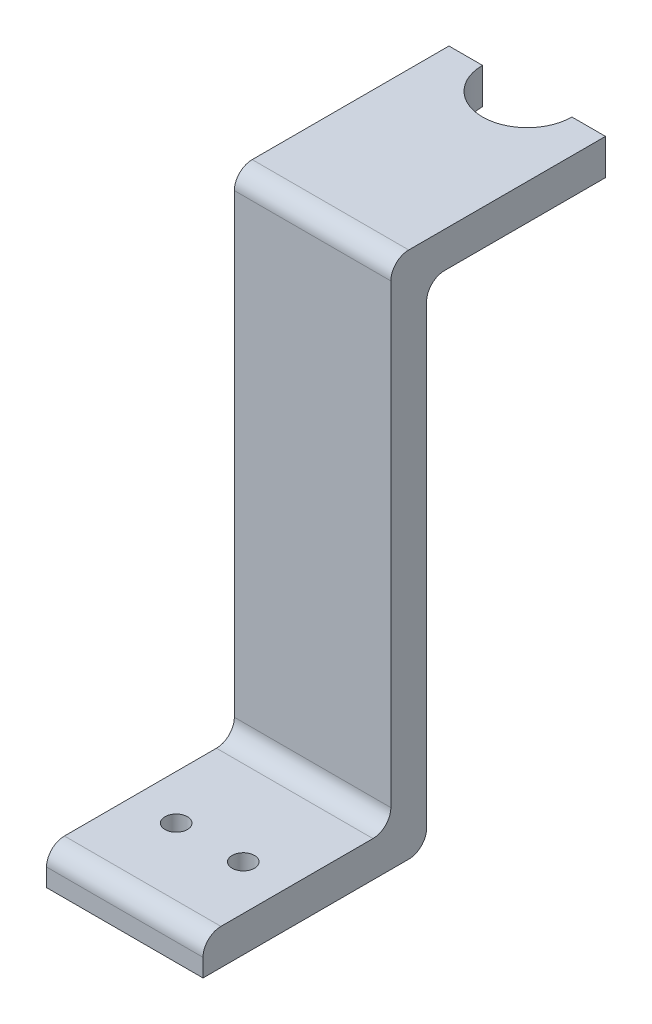
ISO-10303-21;
HEADER;
FILE_DESCRIPTION(('STEP AP214'),'2;1');
FILE_NAME('part.step','',(''),(''),'','','');
FILE_SCHEMA(('AUTOMOTIVE_DESIGN { 1 0 10303 214 1 1 1 1 }'));
ENDSEC;
DATA;
#1=APPLICATION_CONTEXT('core data for automotive mechanical design processes');
#2=APPLICATION_PROTOCOL_DEFINITION('international standard','automotive_design',2000,#1);
#3=PRODUCT_CONTEXT('',#1,'mechanical');
#4=PRODUCT('Part','Part','',(#3));
#5=PRODUCT_RELATED_PRODUCT_CATEGORY('part','',(#4));
#6=PRODUCT_DEFINITION_FORMATION('','',#4);
#7=PRODUCT_DEFINITION_CONTEXT('part definition',#1,'design');
#8=PRODUCT_DEFINITION('design','',#6,#7);
#9=PRODUCT_DEFINITION_SHAPE('','',#8);
#10=(LENGTH_UNIT() NAMED_UNIT(*) SI_UNIT(.MILLI.,.METRE.));
#11=(NAMED_UNIT(*) PLANE_ANGLE_UNIT() SI_UNIT($,.RADIAN.));
#12=(NAMED_UNIT(*) SI_UNIT($,.STERADIAN.) SOLID_ANGLE_UNIT());
#13=UNCERTAINTY_MEASURE_WITH_UNIT(LENGTH_MEASURE(1.E-05),#10,'distance_accuracy_value','');
#14=(GEOMETRIC_REPRESENTATION_CONTEXT(3) GLOBAL_UNCERTAINTY_ASSIGNED_CONTEXT((#13)) GLOBAL_UNIT_ASSIGNED_CONTEXT((#10,
#11,#12)) REPRESENTATION_CONTEXT('',''));
#15=CARTESIAN_POINT('',(0.,0.,0.));
#16=DIRECTION('',(0.,0.,1.));
#17=DIRECTION('',(1.,0.,0.));
#18=AXIS2_PLACEMENT_3D('',#15,#16,#17);
#19=CARTESIAN_POINT('',(35.,110.,-90.));
#20=DIRECTION('',(0.,0.,1.));
#21=DIRECTION('',(1.,0.,0.));
#22=AXIS2_PLACEMENT_3D('',#19,#20,#21);
#23=PLANE('',#22);
#24=DIRECTION('',(-1.,0.,0.));
#25=VECTOR('',#24,1.);
#26=CARTESIAN_POINT('',(35.,110.,-90.));
#27=LINE('',#26,#25);
#28=CARTESIAN_POINT('',(35.,110.,-90.));
#29=VERTEX_POINT('',#28);
#30=CARTESIAN_POINT('',(27.5,110.,-90.));
#31=VERTEX_POINT('',#30);
#32=EDGE_CURVE('E257',#29,#31,#27,.T.);
#33=ORIENTED_EDGE('',*,*,#32,.T.);
#34=DIRECTION('',(0.,1.,0.));
#35=VECTOR('',#34,1.);
#36=CARTESIAN_POINT('',(27.5,108.,-90.));
#37=LINE('',#36,#35);
#38=CARTESIAN_POINT('',(27.5,118.,-90.));
#39=VERTEX_POINT('',#38);
#40=EDGE_CURVE('E196',#31,#39,#37,.T.);
#41=ORIENTED_EDGE('',*,*,#40,.T.);
#42=DIRECTION('',(-1.,0.,0.));
#43=VECTOR('',#42,1.);
#44=CARTESIAN_POINT('',(35.,118.,-90.));
#45=LINE('',#44,#43);
#46=CARTESIAN_POINT('',(35.,118.,-90.));
#47=VERTEX_POINT('',#46);
#48=EDGE_CURVE('E252',#47,#39,#45,.T.);
#49=ORIENTED_EDGE('',*,*,#48,.F.);
#50=DIRECTION('',(0.,1.,0.));
#51=VECTOR('',#50,1.);
#52=CARTESIAN_POINT('',(35.,110.,-90.));
#53=LINE('',#52,#51);
#54=EDGE_CURVE('E299',#29,#47,#53,.T.);
#55=ORIENTED_EDGE('',*,*,#54,.F.);
#56=EDGE_LOOP('',(#33,#41,#49,#55));
#57=FACE_BOUND('',#56,.T.);
#58=ADVANCED_FACE('F48',(#57),#23,.F.);
#59=CARTESIAN_POINT('',(35.,0.,0.));
#60=DIRECTION('',(0.,1.,0.));
#61=DIRECTION('',(0.,0.,1.));
#62=AXIS2_PLACEMENT_3D('',#59,#60,#61);
#63=PLANE('',#62);
#64=CARTESIAN_POINT('',(10.,0.,-19.));
#65=DIRECTION('',(0.,1.,0.));
#66=DIRECTION('',(0.,0.,1.));
#67=AXIS2_PLACEMENT_3D('',#64,#65,#66);
#68=CIRCLE('',#67,2.5);
#69=CARTESIAN_POINT('',(10.,0.,-16.5));
#70=VERTEX_POINT('',#69);
#71=EDGE_CURVE('E339',#70,#70,#68,.T.);
#72=ORIENTED_EDGE('',*,*,#71,.T.);
#73=EDGE_LOOP('',(#72));
#74=FACE_BOUND('',#73,.T.);
#75=CARTESIAN_POINT('',(25.,0.,-19.));
#76=DIRECTION('',(0.,1.,0.));
#77=DIRECTION('',(0.,0.,1.));
#78=AXIS2_PLACEMENT_3D('',#75,#76,#77);
#79=CIRCLE('',#78,2.49999999999999);
#80=CARTESIAN_POINT('',(25.,0.,-16.5));
#81=VERTEX_POINT('',#80);
#82=EDGE_CURVE('E340',#81,#81,#79,.T.);
#83=ORIENTED_EDGE('',*,*,#82,.T.);
#84=EDGE_LOOP('',(#83));
#85=FACE_BOUND('',#84,.T.);
#86=DIRECTION('',(0.,0.,-1.));
#87=VECTOR('',#86,1.);
#88=CARTESIAN_POINT('',(0.,0.,0.));
#89=LINE('',#88,#87);
#90=CARTESIAN_POINT('',(0.,0.,0.));
#91=VERTEX_POINT('',#90);
#92=CARTESIAN_POINT('',(0.,0.,-46.));
#93=VERTEX_POINT('',#92);
#94=EDGE_CURVE('E191',#91,#93,#89,.T.);
#95=ORIENTED_EDGE('',*,*,#94,.T.);
#96=DIRECTION('',(-1.,0.,0.));
#97=VECTOR('',#96,1.);
#98=CARTESIAN_POINT('',(35.,0.,-46.));
#99=LINE('',#98,#97);
#100=CARTESIAN_POINT('',(35.,0.,-46.));
#101=VERTEX_POINT('',#100);
#102=EDGE_CURVE('E57',#101,#93,#99,.T.);
#103=ORIENTED_EDGE('',*,*,#102,.F.);
#104=DIRECTION('',(0.,0.,-1.));
#105=VECTOR('',#104,1.);
#106=CARTESIAN_POINT('',(35.,0.,0.));
#107=LINE('',#106,#105);
#108=CARTESIAN_POINT('',(35.,0.,0.));
#109=VERTEX_POINT('',#108);
#110=EDGE_CURVE('E232',#109,#101,#107,.T.);
#111=ORIENTED_EDGE('',*,*,#110,.F.);
#112=DIRECTION('',(-1.,0.,0.));
#113=VECTOR('',#112,1.);
#114=CARTESIAN_POINT('',(35.,0.,0.));
#115=LINE('',#114,#113);
#116=EDGE_CURVE('E187',#109,#91,#115,.T.);
#117=ORIENTED_EDGE('',*,*,#116,.T.);
#118=EDGE_LOOP('',(#95,#103,#111,#117));
#119=FACE_BOUND('',#118,.T.);
#120=ADVANCED_FACE('F50',(#74,#85,#119),#63,.F.);
#121=CARTESIAN_POINT('',(35.,4.,-46.));
#122=DIRECTION('',(-1.,0.,0.));
#123=DIRECTION('',(0.,0.,1.));
#124=AXIS2_PLACEMENT_3D('',#121,#122,#123);
#125=CYLINDRICAL_SURFACE('',#124,4.);
#126=CARTESIAN_POINT('',(0.,4.,-46.));
#127=DIRECTION('',(1.,0.,0.));
#128=DIRECTION('',(0.,0.,-1.));
#129=AXIS2_PLACEMENT_3D('',#126,#127,#128);
#130=CIRCLE('',#129,4.);
#131=CARTESIAN_POINT('',(0.,4.,-50.));
#132=VERTEX_POINT('',#131);
#133=EDGE_CURVE('E195',#93,#132,#130,.T.);
#134=ORIENTED_EDGE('',*,*,#133,.T.);
#135=DIRECTION('',(-1.,0.,0.));
#136=VECTOR('',#135,1.);
#137=CARTESIAN_POINT('',(35.,4.,-50.));
#138=LINE('',#137,#136);
#139=CARTESIAN_POINT('',(35.,4.,-50.));
#140=VERTEX_POINT('',#139);
#141=EDGE_CURVE('E269',#140,#132,#138,.T.);
#142=ORIENTED_EDGE('',*,*,#141,.F.);
#143=CARTESIAN_POINT('',(35.,4.,-46.));
#144=DIRECTION('',(1.,0.,0.));
#145=DIRECTION('',(0.,0.,-1.));
#146=AXIS2_PLACEMENT_3D('',#143,#144,#145);
#147=CIRCLE('',#146,4.);
#148=EDGE_CURVE('E129',#101,#140,#147,.T.);
#149=ORIENTED_EDGE('',*,*,#148,.F.);
#150=ORIENTED_EDGE('',*,*,#102,.T.);
#151=EDGE_LOOP('',(#134,#142,#149,#150));
#152=FACE_BOUND('',#151,.T.);
#153=ADVANCED_FACE('F274',(#152),#125,.T.);
#154=CARTESIAN_POINT('',(35.,4.,-50.));
#155=DIRECTION('',(0.,0.,1.));
#156=DIRECTION('',(1.,0.,0.));
#157=AXIS2_PLACEMENT_3D('',#154,#155,#156);
#158=PLANE('',#157);
#159=DIRECTION('',(0.,1.,0.));
#160=VECTOR('',#159,1.);
#161=CARTESIAN_POINT('',(0.,4.,-50.));
#162=LINE('',#161,#160);
#163=CARTESIAN_POINT('',(0.,106.,-50.));
#164=VERTEX_POINT('',#163);
#165=EDGE_CURVE('E199',#132,#164,#162,.T.);
#166=ORIENTED_EDGE('',*,*,#165,.T.);
#167=DIRECTION('',(-1.,0.,0.));
#168=VECTOR('',#167,1.);
#169=CARTESIAN_POINT('',(35.,106.,-50.));
#170=LINE('',#169,#168);
#171=CARTESIAN_POINT('',(35.,106.,-50.));
#172=VERTEX_POINT('',#171);
#173=EDGE_CURVE('E265',#172,#164,#170,.T.);
#174=ORIENTED_EDGE('',*,*,#173,.F.);
#175=DIRECTION('',(0.,1.,0.));
#176=VECTOR('',#175,1.);
#177=CARTESIAN_POINT('',(35.,4.,-50.));
#178=LINE('',#177,#176);
#179=EDGE_CURVE('E295',#140,#172,#178,.T.);
#180=ORIENTED_EDGE('',*,*,#179,.F.);
#181=ORIENTED_EDGE('',*,*,#141,.T.);
#182=EDGE_LOOP('',(#166,#174,#180,#181));
#183=FACE_BOUND('',#182,.T.);
#184=ADVANCED_FACE('F285',(#183),#158,.F.);
#185=CARTESIAN_POINT('',(35.,106.,-54.));
#186=DIRECTION('',(-1.,0.,0.));
#187=DIRECTION('',(0.,0.,1.));
#188=AXIS2_PLACEMENT_3D('',#185,#186,#187);
#189=CYLINDRICAL_SURFACE('',#188,4.00000000000001);
#190=CARTESIAN_POINT('',(0.,106.,-54.));
#191=DIRECTION('',(-1.,0.,0.));
#192=DIRECTION('',(0.,0.,-1.));
#193=AXIS2_PLACEMENT_3D('',#190,#191,#192);
#194=CIRCLE('',#193,4.00000000000001);
#195=CARTESIAN_POINT('',(0.,110.,-54.));
#196=VERTEX_POINT('',#195);
#197=EDGE_CURVE('E202',#164,#196,#194,.T.);
#198=ORIENTED_EDGE('',*,*,#197,.T.);
#199=DIRECTION('',(-1.,0.,0.));
#200=VECTOR('',#199,1.);
#201=CARTESIAN_POINT('',(35.,110.,-54.));
#202=LINE('',#201,#200);
#203=CARTESIAN_POINT('',(35.,110.,-54.));
#204=VERTEX_POINT('',#203);
#205=EDGE_CURVE('E261',#204,#196,#202,.T.);
#206=ORIENTED_EDGE('',*,*,#205,.F.);
#207=CARTESIAN_POINT('',(35.,106.,-54.));
#208=DIRECTION('',(-1.,0.,0.));
#209=DIRECTION('',(0.,0.,-1.));
#210=AXIS2_PLACEMENT_3D('',#207,#208,#209);
#211=CIRCLE('',#210,4.00000000000001);
#212=EDGE_CURVE('E291',#172,#204,#211,.T.);
#213=ORIENTED_EDGE('',*,*,#212,.F.);
#214=ORIENTED_EDGE('',*,*,#173,.T.);
#215=EDGE_LOOP('',(#198,#206,#213,#214));
#216=FACE_BOUND('',#215,.T.);
#217=ADVANCED_FACE('F289',(#216),#189,.F.);
#218=CARTESIAN_POINT('',(35.,110.,-54.));
#219=DIRECTION('',(0.,1.,0.));
#220=DIRECTION('',(0.,0.,1.));
#221=AXIS2_PLACEMENT_3D('',#218,#219,#220);
#222=PLANE('',#221);
#223=CARTESIAN_POINT('',(7.5,110.,-90.));
#224=VERTEX_POINT('',#223);
#225=CARTESIAN_POINT('',(0.,110.,-90.));
#226=VERTEX_POINT('',#225);
#227=EDGE_CURVE('E256',#224,#226,#27,.T.);
#228=ORIENTED_EDGE('',*,*,#227,.F.);
#229=CARTESIAN_POINT('',(17.5,110.,-90.));
#230=DIRECTION('',(0.,1.,0.));
#231=DIRECTION('',(0.,0.,1.));
#232=AXIS2_PLACEMENT_3D('',#229,#230,#231);
#233=CIRCLE('',#232,10.);
#234=EDGE_CURVE('E333',#224,#31,#233,.T.);
#235=ORIENTED_EDGE('',*,*,#234,.T.);
#236=ORIENTED_EDGE('',*,*,#32,.F.);
#237=DIRECTION('',(0.,0.,-1.));
#238=VECTOR('',#237,1.);
#239=CARTESIAN_POINT('',(35.,110.,-54.));
#240=LINE('',#239,#238);
#241=EDGE_CURVE('E294',#204,#29,#240,.T.);
#242=ORIENTED_EDGE('',*,*,#241,.F.);
#243=ORIENTED_EDGE('',*,*,#205,.T.);
#244=DIRECTION('',(0.,0.,-1.));
#245=VECTOR('',#244,1.);
#246=CARTESIAN_POINT('',(0.,110.,-54.));
#247=LINE('',#246,#245);
#248=EDGE_CURVE('E205',#196,#226,#247,.T.);
#249=ORIENTED_EDGE('',*,*,#248,.T.);
#250=EDGE_LOOP('',(#228,#235,#236,#242,#243,#249));
#251=FACE_BOUND('',#250,.T.);
#252=ADVANCED_FACE('F392',(#251),#222,.F.);
#253=CARTESIAN_POINT('',(7.5,118.,-90.));
#254=VERTEX_POINT('',#253);
#255=CARTESIAN_POINT('',(0.,118.,-90.));
#256=VERTEX_POINT('',#255);
#257=EDGE_CURVE('E251',#254,#256,#45,.T.);
#258=ORIENTED_EDGE('',*,*,#257,.F.);
#259=DIRECTION('',(0.,1.,0.));
#260=VECTOR('',#259,1.);
#261=CARTESIAN_POINT('',(7.5,108.,-90.));
#262=LINE('',#261,#260);
#263=EDGE_CURVE('E64',#254,#224,#262,.F.);
#264=ORIENTED_EDGE('',*,*,#263,.T.);
#265=ORIENTED_EDGE('',*,*,#227,.T.);
#266=DIRECTION('',(0.,1.,0.));
#267=VECTOR('',#266,1.);
#268=CARTESIAN_POINT('',(0.,110.,-90.));
#269=LINE('',#268,#267);
#270=EDGE_CURVE('E209',#226,#256,#269,.T.);
#271=ORIENTED_EDGE('',*,*,#270,.T.);
#272=EDGE_LOOP('',(#258,#264,#265,#271));
#273=FACE_BOUND('',#272,.T.);
#274=ADVANCED_FACE('F382',(#273),#23,.F.);
#275=CARTESIAN_POINT('',(35.,118.,-90.));
#276=DIRECTION('',(0.,-1.,0.));
#277=DIRECTION('',(0.,0.,-1.));
#278=AXIS2_PLACEMENT_3D('',#275,#276,#277);
#279=PLANE('',#278);
#280=ORIENTED_EDGE('',*,*,#48,.T.);
#281=CARTESIAN_POINT('',(17.5,118.,-90.));
#282=DIRECTION('',(0.,-1.,0.));
#283=DIRECTION('',(0.,0.,-1.));
#284=AXIS2_PLACEMENT_3D('',#281,#282,#283);
#285=CIRCLE('',#284,10.);
#286=EDGE_CURVE('E12',#39,#254,#285,.T.);
#287=ORIENTED_EDGE('',*,*,#286,.T.);
#288=ORIENTED_EDGE('',*,*,#257,.T.);
#289=DIRECTION('',(0.,0.,1.));
#290=VECTOR('',#289,1.);
#291=CARTESIAN_POINT('',(0.,118.,-90.));
#292=LINE('',#291,#290);
#293=CARTESIAN_POINT('',(0.,118.,-46.));
#294=VERTEX_POINT('',#293);
#295=EDGE_CURVE('E213',#256,#294,#292,.T.);
#296=ORIENTED_EDGE('',*,*,#295,.T.);
#297=DIRECTION('',(-1.,0.,0.));
#298=VECTOR('',#297,1.);
#299=CARTESIAN_POINT('',(35.,118.,-46.));
#300=LINE('',#299,#298);
#301=CARTESIAN_POINT('',(35.,118.,-46.));
#302=VERTEX_POINT('',#301);
#303=EDGE_CURVE('E247',#302,#294,#300,.T.);
#304=ORIENTED_EDGE('',*,*,#303,.F.);
#305=DIRECTION('',(0.,0.,1.));
#306=VECTOR('',#305,1.);
#307=CARTESIAN_POINT('',(35.,118.,-90.));
#308=LINE('',#307,#306);
#309=EDGE_CURVE('E306',#47,#302,#308,.T.);
#310=ORIENTED_EDGE('',*,*,#309,.F.);
#311=EDGE_LOOP('',(#280,#287,#288,#296,#304,#310));
#312=FACE_BOUND('',#311,.T.);
#313=ADVANCED_FACE('F391',(#312),#279,.F.);
#314=CARTESIAN_POINT('',(35.,114.,-46.));
#315=DIRECTION('',(-1.,0.,0.));
#316=DIRECTION('',(0.,0.,1.));
#317=AXIS2_PLACEMENT_3D('',#314,#315,#316);
#318=CYLINDRICAL_SURFACE('',#317,4.);
#319=CARTESIAN_POINT('',(0.,114.,-46.));
#320=DIRECTION('',(1.,0.,0.));
#321=DIRECTION('',(0.,0.,-1.));
#322=AXIS2_PLACEMENT_3D('',#319,#320,#321);
#323=CIRCLE('',#322,4.);
#324=CARTESIAN_POINT('',(0.,114.,-42.));
#325=VERTEX_POINT('',#324);
#326=EDGE_CURVE('E216',#294,#325,#323,.T.);
#327=ORIENTED_EDGE('',*,*,#326,.T.);
#328=DIRECTION('',(-1.,0.,0.));
#329=VECTOR('',#328,1.);
#330=CARTESIAN_POINT('',(35.,114.,-42.));
#331=LINE('',#330,#329);
#332=CARTESIAN_POINT('',(35.,114.,-42.));
#333=VERTEX_POINT('',#332);
#334=EDGE_CURVE('E243',#333,#325,#331,.T.);
#335=ORIENTED_EDGE('',*,*,#334,.F.);
#336=CARTESIAN_POINT('',(35.,114.,-46.));
#337=DIRECTION('',(1.,0.,0.));
#338=DIRECTION('',(0.,0.,-1.));
#339=AXIS2_PLACEMENT_3D('',#336,#337,#338);
#340=CIRCLE('',#339,4.);
#341=EDGE_CURVE('E309',#302,#333,#340,.T.);
#342=ORIENTED_EDGE('',*,*,#341,.F.);
#343=ORIENTED_EDGE('',*,*,#303,.T.);
#344=EDGE_LOOP('',(#327,#335,#342,#343));
#345=FACE_BOUND('',#344,.T.);
#346=ADVANCED_FACE('F397',(#345),#318,.T.);
#347=CARTESIAN_POINT('',(35.,12.,-42.));
#348=DIRECTION('',(0.,0.,-1.));
#349=DIRECTION('',(0.,1.,0.));
#350=AXIS2_PLACEMENT_3D('',#347,#348,#349);
#351=PLANE('',#350);
#352=DIRECTION('',(0.,-1.,0.));
#353=VECTOR('',#352,1.);
#354=CARTESIAN_POINT('',(0.,12.,-42.));
#355=LINE('',#354,#353);
#356=CARTESIAN_POINT('',(0.,12.,-42.));
#357=VERTEX_POINT('',#356);
#358=EDGE_CURVE('E219',#325,#357,#355,.T.);
#359=ORIENTED_EDGE('',*,*,#358,.T.);
#360=DIRECTION('',(-1.,0.,0.));
#361=VECTOR('',#360,1.);
#362=CARTESIAN_POINT('',(35.,12.,-42.));
#363=LINE('',#362,#361);
#364=CARTESIAN_POINT('',(35.,12.,-42.));
#365=VERTEX_POINT('',#364);
#366=EDGE_CURVE('E239',#365,#357,#363,.T.);
#367=ORIENTED_EDGE('',*,*,#366,.F.);
#368=DIRECTION('',(0.,-1.,0.));
#369=VECTOR('',#368,1.);
#370=CARTESIAN_POINT('',(35.,12.,-42.));
#371=LINE('',#370,#369);
#372=EDGE_CURVE('E312',#333,#365,#371,.T.);
#373=ORIENTED_EDGE('',*,*,#372,.F.);
#374=ORIENTED_EDGE('',*,*,#334,.T.);
#375=EDGE_LOOP('',(#359,#367,#373,#374));
#376=FACE_BOUND('',#375,.T.);
#377=ADVANCED_FACE('F320',(#376),#351,.F.);
#378=CARTESIAN_POINT('',(35.,12.,-38.));
#379=DIRECTION('',(-1.,0.,0.));
#380=DIRECTION('',(0.,0.,1.));
#381=AXIS2_PLACEMENT_3D('',#378,#379,#380);
#382=CYLINDRICAL_SURFACE('',#381,4.);
#383=CARTESIAN_POINT('',(0.,12.,-38.));
#384=DIRECTION('',(-1.,0.,0.));
#385=DIRECTION('',(0.,0.,1.));
#386=AXIS2_PLACEMENT_3D('',#383,#384,#385);
#387=CIRCLE('',#386,4.);
#388=CARTESIAN_POINT('',(0.,8.,-38.));
#389=VERTEX_POINT('',#388);
#390=EDGE_CURVE('E222',#357,#389,#387,.T.);
#391=ORIENTED_EDGE('',*,*,#390,.T.);
#392=DIRECTION('',(-1.,0.,0.));
#393=VECTOR('',#392,1.);
#394=CARTESIAN_POINT('',(35.,8.,-38.));
#395=LINE('',#394,#393);
#396=CARTESIAN_POINT('',(35.,8.,-38.));
#397=VERTEX_POINT('',#396);
#398=EDGE_CURVE('E180',#397,#389,#395,.T.);
#399=ORIENTED_EDGE('',*,*,#398,.F.);
#400=CARTESIAN_POINT('',(35.,12.,-38.));
#401=DIRECTION('',(-1.,0.,0.));
#402=DIRECTION('',(0.,0.,1.));
#403=AXIS2_PLACEMENT_3D('',#400,#401,#402);
#404=CIRCLE('',#403,4.);
#405=EDGE_CURVE('E166',#365,#397,#404,.T.);
#406=ORIENTED_EDGE('',*,*,#405,.F.);
#407=ORIENTED_EDGE('',*,*,#366,.T.);
#408=EDGE_LOOP('',(#391,#399,#406,#407));
#409=FACE_BOUND('',#408,.T.);
#410=ADVANCED_FACE('F324',(#409),#382,.F.);
#411=CARTESIAN_POINT('',(35.,8.,-4.));
#412=DIRECTION('',(0.,-1.,0.));
#413=DIRECTION('',(0.,0.,-1.));
#414=AXIS2_PLACEMENT_3D('',#411,#412,#413);
#415=PLANE('',#414);
#416=CARTESIAN_POINT('',(10.,8.,-19.));
#417=DIRECTION('',(0.,1.,0.));
#418=DIRECTION('',(0.,0.,1.));
#419=AXIS2_PLACEMENT_3D('',#416,#417,#418);
#420=CIRCLE('',#419,2.5);
#421=CARTESIAN_POINT('',(10.,8.,-16.5));
#422=VERTEX_POINT('',#421);
#423=EDGE_CURVE('E348',#422,#422,#420,.T.);
#424=ORIENTED_EDGE('',*,*,#423,.F.);
#425=EDGE_LOOP('',(#424));
#426=FACE_BOUND('',#425,.T.);
#427=CARTESIAN_POINT('',(25.,8.,-19.));
#428=DIRECTION('',(0.,1.,0.));
#429=DIRECTION('',(0.,0.,1.));
#430=AXIS2_PLACEMENT_3D('',#427,#428,#429);
#431=CIRCLE('',#430,2.49999999999999);
#432=CARTESIAN_POINT('',(25.,8.,-16.5));
#433=VERTEX_POINT('',#432);
#434=EDGE_CURVE('E344',#433,#433,#431,.T.);
#435=ORIENTED_EDGE('',*,*,#434,.F.);
#436=EDGE_LOOP('',(#435));
#437=FACE_BOUND('',#436,.T.);
#438=DIRECTION('',(0.,0.,1.));
#439=VECTOR('',#438,1.);
#440=CARTESIAN_POINT('',(0.,8.,-4.));
#441=LINE('',#440,#439);
#442=CARTESIAN_POINT('',(0.,8.,-4.));
#443=VERTEX_POINT('',#442);
#444=EDGE_CURVE('E176',#389,#443,#441,.T.);
#445=ORIENTED_EDGE('',*,*,#444,.T.);
#446=DIRECTION('',(-1.,0.,0.));
#447=VECTOR('',#446,1.);
#448=CARTESIAN_POINT('',(35.,8.,-4.));
#449=LINE('',#448,#447);
#450=CARTESIAN_POINT('',(35.,8.,-4.));
#451=VERTEX_POINT('',#450);
#452=EDGE_CURVE('E173',#451,#443,#449,.T.);
#453=ORIENTED_EDGE('',*,*,#452,.F.);
#454=DIRECTION('',(0.,0.,1.));
#455=VECTOR('',#454,1.);
#456=CARTESIAN_POINT('',(35.,8.,-4.));
#457=LINE('',#456,#455);
#458=EDGE_CURVE('E159',#397,#451,#457,.T.);
#459=ORIENTED_EDGE('',*,*,#458,.F.);
#460=ORIENTED_EDGE('',*,*,#398,.T.);
#461=EDGE_LOOP('',(#445,#453,#459,#460));
#462=FACE_BOUND('',#461,.T.);
#463=ADVANCED_FACE('F174',(#426,#437,#462),#415,.F.);
#464=CARTESIAN_POINT('',(35.,4.,-4.));
#465=DIRECTION('',(-1.,0.,0.));
#466=DIRECTION('',(0.,0.,1.));
#467=AXIS2_PLACEMENT_3D('',#464,#465,#466);
#468=CYLINDRICAL_SURFACE('',#467,4.);
#469=CARTESIAN_POINT('',(0.,4.,-4.));
#470=DIRECTION('',(1.,0.,0.));
#471=DIRECTION('',(0.,0.,-1.));
#472=AXIS2_PLACEMENT_3D('',#469,#470,#471);
#473=CIRCLE('',#472,4.);
#474=CARTESIAN_POINT('',(0.,4.,0.));
#475=VERTEX_POINT('',#474);
#476=EDGE_CURVE('E227',#443,#475,#473,.T.);
#477=ORIENTED_EDGE('',*,*,#476,.T.);
#478=DIRECTION('',(-1.,0.,0.));
#479=VECTOR('',#478,1.);
#480=CARTESIAN_POINT('',(35.,4.,0.));
#481=LINE('',#480,#479);
#482=CARTESIAN_POINT('',(35.,4.,0.));
#483=VERTEX_POINT('',#482);
#484=EDGE_CURVE('E181',#483,#475,#481,.T.);
#485=ORIENTED_EDGE('',*,*,#484,.F.);
#486=CARTESIAN_POINT('',(35.,4.,-4.));
#487=DIRECTION('',(1.,0.,0.));
#488=DIRECTION('',(0.,0.,-1.));
#489=AXIS2_PLACEMENT_3D('',#486,#487,#488);
#490=CIRCLE('',#489,4.);
#491=EDGE_CURVE('E163',#451,#483,#490,.T.);
#492=ORIENTED_EDGE('',*,*,#491,.F.);
#493=ORIENTED_EDGE('',*,*,#452,.T.);
#494=EDGE_LOOP('',(#477,#485,#492,#493));
#495=FACE_BOUND('',#494,.T.);
#496=ADVANCED_FACE('F183',(#495),#468,.T.);
#497=CARTESIAN_POINT('',(35.,0.,0.));
#498=DIRECTION('',(0.,0.,-1.));
#499=DIRECTION('',(-1.,0.,0.));
#500=AXIS2_PLACEMENT_3D('',#497,#498,#499);
#501=PLANE('',#500);
#502=DIRECTION('',(0.,-1.,0.));
#503=VECTOR('',#502,1.);
#504=CARTESIAN_POINT('',(0.,0.,0.));
#505=LINE('',#504,#503);
#506=EDGE_CURVE('E120',#475,#91,#505,.T.);
#507=ORIENTED_EDGE('',*,*,#506,.T.);
#508=ORIENTED_EDGE('',*,*,#116,.F.);
#509=DIRECTION('',(0.,-1.,0.));
#510=VECTOR('',#509,1.);
#511=CARTESIAN_POINT('',(35.,0.,0.));
#512=LINE('',#511,#510);
#513=EDGE_CURVE('E72',#483,#109,#512,.T.);
#514=ORIENTED_EDGE('',*,*,#513,.F.);
#515=ORIENTED_EDGE('',*,*,#484,.T.);
#516=EDGE_LOOP('',(#507,#508,#514,#515));
#517=FACE_BOUND('',#516,.T.);
#518=ADVANCED_FACE('F325',(#517),#501,.F.);
#519=CARTESIAN_POINT('',(35.,4.,-46.));
#520=DIRECTION('',(1.,0.,0.));
#521=DIRECTION('',(0.,0.,-1.));
#522=AXIS2_PLACEMENT_3D('',#519,#520,#521);
#523=PLANE('',#522);
#524=ORIENTED_EDGE('',*,*,#110,.T.);
#525=ORIENTED_EDGE('',*,*,#148,.T.);
#526=ORIENTED_EDGE('',*,*,#179,.T.);
#527=ORIENTED_EDGE('',*,*,#212,.T.);
#528=ORIENTED_EDGE('',*,*,#241,.T.);
#529=ORIENTED_EDGE('',*,*,#54,.T.);
#530=ORIENTED_EDGE('',*,*,#309,.T.);
#531=ORIENTED_EDGE('',*,*,#341,.T.);
#532=ORIENTED_EDGE('',*,*,#372,.T.);
#533=ORIENTED_EDGE('',*,*,#405,.T.);
#534=ORIENTED_EDGE('',*,*,#458,.T.);
#535=ORIENTED_EDGE('',*,*,#491,.T.);
#536=ORIENTED_EDGE('',*,*,#513,.T.);
#537=EDGE_LOOP('',(#524,#525,#526,#527,#528,#529,#530,#531,#532,#533,#534,#535,#536));
#538=FACE_BOUND('',#537,.T.);
#539=ADVANCED_FACE('F161',(#538),#523,.T.);
#540=CARTESIAN_POINT('',(0.,4.,-46.));
#541=DIRECTION('',(1.,0.,0.));
#542=DIRECTION('',(0.,0.,-1.));
#543=AXIS2_PLACEMENT_3D('',#540,#541,#542);
#544=PLANE('',#543);
#545=ORIENTED_EDGE('',*,*,#94,.F.);
#546=ORIENTED_EDGE('',*,*,#506,.F.);
#547=ORIENTED_EDGE('',*,*,#476,.F.);
#548=ORIENTED_EDGE('',*,*,#444,.F.);
#549=ORIENTED_EDGE('',*,*,#390,.F.);
#550=ORIENTED_EDGE('',*,*,#358,.F.);
#551=ORIENTED_EDGE('',*,*,#326,.F.);
#552=ORIENTED_EDGE('',*,*,#295,.F.);
#553=ORIENTED_EDGE('',*,*,#270,.F.);
#554=ORIENTED_EDGE('',*,*,#248,.F.);
#555=ORIENTED_EDGE('',*,*,#197,.F.);
#556=ORIENTED_EDGE('',*,*,#165,.F.);
#557=ORIENTED_EDGE('',*,*,#133,.F.);
#558=EDGE_LOOP('',(#545,#546,#547,#548,#549,#550,#551,#552,#553,#554,#555,#556,#557));
#559=FACE_BOUND('',#558,.T.);
#560=ADVANCED_FACE('F279',(#559),#544,.F.);
#561=CARTESIAN_POINT('',(17.5,108.,-90.));
#562=DIRECTION('',(0.,1.,0.));
#563=DIRECTION('',(0.,0.,1.));
#564=AXIS2_PLACEMENT_3D('',#561,#562,#563);
#565=CYLINDRICAL_SURFACE('',#564,10.);
#566=ORIENTED_EDGE('',*,*,#234,.F.);
#567=ORIENTED_EDGE('',*,*,#263,.F.);
#568=ORIENTED_EDGE('',*,*,#286,.F.);
#569=ORIENTED_EDGE('',*,*,#40,.F.);
#570=EDGE_LOOP('',(#566,#567,#568,#569));
#571=FACE_BOUND('',#570,.T.);
#572=ADVANCED_FACE('F371',(#571),#565,.F.);
#573=CARTESIAN_POINT('',(25.,0.,-19.));
#574=DIRECTION('',(0.,1.,0.));
#575=DIRECTION('',(0.,0.,1.));
#576=AXIS2_PLACEMENT_3D('',#573,#574,#575);
#577=CYLINDRICAL_SURFACE('',#576,2.49999999999999);
#578=ORIENTED_EDGE('',*,*,#82,.F.);
#579=EDGE_LOOP('',(#578));
#580=FACE_BOUND('',#579,.T.);
#581=ORIENTED_EDGE('',*,*,#434,.T.);
#582=EDGE_LOOP('',(#581));
#583=FACE_BOUND('',#582,.T.);
#584=ADVANCED_FACE('F361',(#580,#583),#577,.F.);
#585=CARTESIAN_POINT('',(10.,0.,-19.));
#586=DIRECTION('',(0.,1.,0.));
#587=DIRECTION('',(0.,0.,1.));
#588=AXIS2_PLACEMENT_3D('',#585,#586,#587);
#589=CYLINDRICAL_SURFACE('',#588,2.5);
#590=ORIENTED_EDGE('',*,*,#71,.F.);
#591=EDGE_LOOP('',(#590));
#592=FACE_BOUND('',#591,.T.);
#593=ORIENTED_EDGE('',*,*,#423,.T.);
#594=EDGE_LOOP('',(#593));
#595=FACE_BOUND('',#594,.T.);
#596=ADVANCED_FACE('F358',(#592,#595),#589,.F.);
#597=CLOSED_SHELL('',(#58,#120,#153,#184,#217,#252,#274,#313,#346,#377,#410,#463,#496,#518,#539,
#560,#572,#584,#596));
#598=MANIFOLD_SOLID_BREP('B2',#597);
#599=ADVANCED_BREP_SHAPE_REPRESENTATION('',(#18,#598),#14);
#600=SHAPE_DEFINITION_REPRESENTATION(#9,#599);
ENDSEC;
END-ISO-10303-21;
